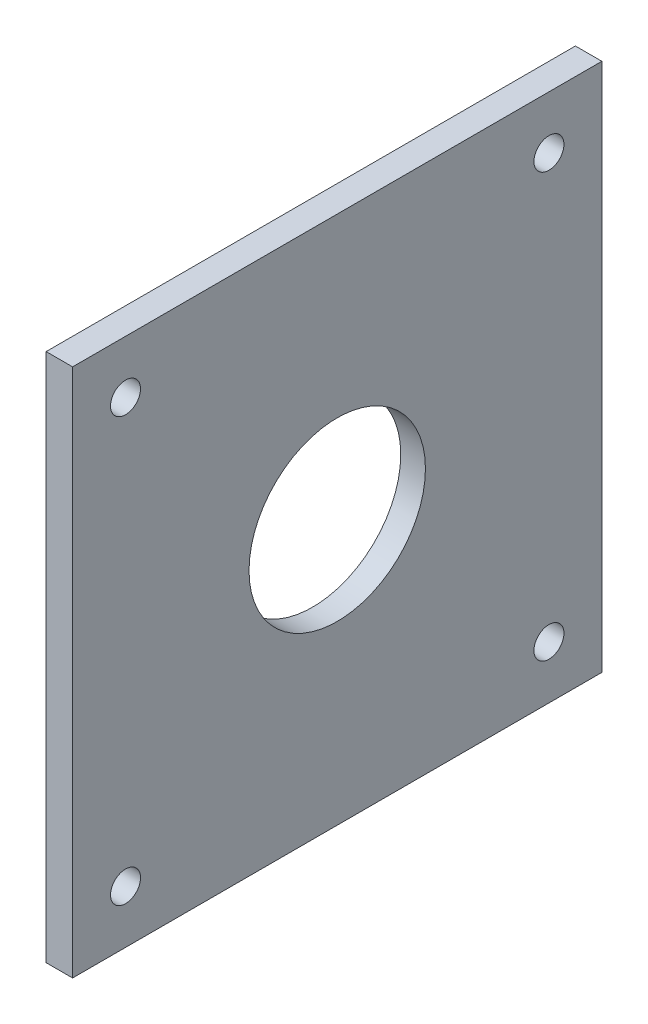
ISO-10303-21;
HEADER;
FILE_DESCRIPTION(('STEP AP214'),'2;1');
FILE_NAME('part.step','',(''),(''),'','','');
FILE_SCHEMA(('AUTOMOTIVE_DESIGN { 1 0 10303 214 1 1 1 1 }'));
ENDSEC;
DATA;
#1=APPLICATION_CONTEXT('core data for automotive mechanical design processes');
#2=APPLICATION_PROTOCOL_DEFINITION('international standard','automotive_design',2000,#1);
#3=PRODUCT_CONTEXT('',#1,'mechanical');
#4=PRODUCT('Part','Part','',(#3));
#5=PRODUCT_RELATED_PRODUCT_CATEGORY('part','',(#4));
#6=PRODUCT_DEFINITION_FORMATION('','',#4);
#7=PRODUCT_DEFINITION_CONTEXT('part definition',#1,'design');
#8=PRODUCT_DEFINITION('design','',#6,#7);
#9=PRODUCT_DEFINITION_SHAPE('','',#8);
#10=(LENGTH_UNIT() NAMED_UNIT(*) SI_UNIT(.MILLI.,.METRE.));
#11=(NAMED_UNIT(*) PLANE_ANGLE_UNIT() SI_UNIT($,.RADIAN.));
#12=(NAMED_UNIT(*) SI_UNIT($,.STERADIAN.) SOLID_ANGLE_UNIT());
#13=UNCERTAINTY_MEASURE_WITH_UNIT(LENGTH_MEASURE(1.E-05),#10,'distance_accuracy_value','');
#14=(GEOMETRIC_REPRESENTATION_CONTEXT(3) GLOBAL_UNCERTAINTY_ASSIGNED_CONTEXT((#13)) GLOBAL_UNIT_ASSIGNED_CONTEXT((#10,
#11,#12)) REPRESENTATION_CONTEXT('',''));
#15=CARTESIAN_POINT('',(0.,0.,0.));
#16=DIRECTION('',(0.,0.,1.));
#17=DIRECTION('',(1.,0.,0.));
#18=AXIS2_PLACEMENT_3D('',#15,#16,#17);
#19=CARTESIAN_POINT('',(0.007799999999975,30.,30.000049774017));
#20=DIRECTION('',(1.,0.,0.));
#21=DIRECTION('',(0.,0.,-1.));
#22=AXIS2_PLACEMENT_3D('',#19,#20,#21);
#23=CYLINDRICAL_SURFACE('',#22,11.1);
#24=CARTESIAN_POINT('',(0.007800000000003,30.,30.000049774017));
#25=DIRECTION('',(1.,0.,0.));
#26=DIRECTION('',(0.,0.,-1.));
#27=AXIS2_PLACEMENT_3D('',#24,#25,#26);
#28=CIRCLE('',#27,11.1);
#29=CARTESIAN_POINT('',(0.007800000000003,30.,18.900049774017));
#30=VERTEX_POINT('',#29);
#31=EDGE_CURVE('E72',#30,#30,#28,.F.);
#32=ORIENTED_EDGE('',*,*,#31,.T.);
#33=EDGE_LOOP('',(#32));
#34=FACE_BOUND('',#33,.T.);
#35=CARTESIAN_POINT('',(0.2078,30.,30.000049774017));
#36=DIRECTION('',(1.,0.,0.));
#37=DIRECTION('',(0.,0.,-1.));
#38=AXIS2_PLACEMENT_3D('',#35,#36,#37);
#39=CIRCLE('',#38,11.1);
#40=CARTESIAN_POINT('',(0.2078,30.,18.900049774017));
#41=VERTEX_POINT('',#40);
#42=EDGE_CURVE('E19',#41,#41,#39,.T.);
#43=ORIENTED_EDGE('',*,*,#42,.T.);
#44=EDGE_LOOP('',(#43));
#45=FACE_BOUND('',#44,.T.);
#46=ADVANCED_FACE('F16',(#34,#45),#23,.F.);
#47=CARTESIAN_POINT('',(0.2078,30.,30.000049774017));
#48=DIRECTION('',(1.,0.,0.));
#49=DIRECTION('',(0.,0.,-1.));
#50=AXIS2_PLACEMENT_3D('',#47,#48,#49);
#51=PLANE('',#50);
#52=CARTESIAN_POINT('',(0.2078,30.,30.000049774017));
#53=DIRECTION('',(1.,0.,0.));
#54=DIRECTION('',(0.,0.,-1.));
#55=AXIS2_PLACEMENT_3D('',#52,#53,#54);
#56=CIRCLE('',#55,10.);
#57=CARTESIAN_POINT('',(0.2078,30.,20.000049774017));
#58=VERTEX_POINT('',#57);
#59=EDGE_CURVE('E102',#58,#58,#56,.T.);
#60=ORIENTED_EDGE('',*,*,#59,.T.);
#61=EDGE_LOOP('',(#60));
#62=FACE_BOUND('',#61,.T.);
#63=ORIENTED_EDGE('',*,*,#42,.F.);
#64=EDGE_LOOP('',(#63));
#65=FACE_BOUND('',#64,.T.);
#66=ADVANCED_FACE('F117',(#62,#65),#51,.F.);
#67=CARTESIAN_POINT('',(0.007799999999975,0.,4.977401658834E-05));
#68=DIRECTION('',(1.,0.,0.));
#69=DIRECTION('',(0.,0.,-1.));
#70=AXIS2_PLACEMENT_3D('',#67,#68,#69);
#71=PLANE('',#70);
#72=CARTESIAN_POINT('',(0.007800000000003,54.,54.000049774017));
#73=DIRECTION('',(1.,0.,0.));
#74=DIRECTION('',(0.,0.,-1.));
#75=AXIS2_PLACEMENT_3D('',#72,#73,#74);
#76=CIRCLE('',#75,1.7);
#77=CARTESIAN_POINT('',(0.007800000000003,54.,52.300049774017));
#78=VERTEX_POINT('',#77);
#79=EDGE_CURVE('E95',#78,#78,#76,.T.);
#80=ORIENTED_EDGE('',*,*,#79,.T.);
#81=EDGE_LOOP('',(#80));
#82=FACE_BOUND('',#81,.T.);
#83=CARTESIAN_POINT('',(0.007800000000003,6.,54.000049774017));
#84=DIRECTION('',(1.,0.,0.));
#85=DIRECTION('',(0.,0.,-1.));
#86=AXIS2_PLACEMENT_3D('',#83,#84,#85);
#87=CIRCLE('',#86,1.7);
#88=CARTESIAN_POINT('',(0.007800000000003,6.,52.300049774017));
#89=VERTEX_POINT('',#88);
#90=EDGE_CURVE('E99',#89,#89,#87,.T.);
#91=ORIENTED_EDGE('',*,*,#90,.T.);
#92=EDGE_LOOP('',(#91));
#93=FACE_BOUND('',#92,.T.);
#94=ORIENTED_EDGE('',*,*,#31,.F.);
#95=EDGE_LOOP('',(#94));
#96=FACE_BOUND('',#95,.T.);
#97=CARTESIAN_POINT('',(0.007800000000003,54.,6.000049774017));
#98=DIRECTION('',(1.,0.,0.));
#99=DIRECTION('',(0.,0.,-1.));
#100=AXIS2_PLACEMENT_3D('',#97,#98,#99);
#101=CIRCLE('',#100,1.7);
#102=CARTESIAN_POINT('',(0.007800000000003,54.,4.300049774017));
#103=VERTEX_POINT('',#102);
#104=EDGE_CURVE('E105',#103,#103,#101,.T.);
#105=ORIENTED_EDGE('',*,*,#104,.T.);
#106=EDGE_LOOP('',(#105));
#107=FACE_BOUND('',#106,.T.);
#108=CARTESIAN_POINT('',(0.007800000000003,6.,6.000049774017));
#109=DIRECTION('',(1.,0.,0.));
#110=DIRECTION('',(0.,0.,-1.));
#111=AXIS2_PLACEMENT_3D('',#108,#109,#110);
#112=CIRCLE('',#111,1.7);
#113=CARTESIAN_POINT('',(0.007800000000003,6.,4.300049774017));
#114=VERTEX_POINT('',#113);
#115=EDGE_CURVE('E108',#114,#114,#112,.T.);
#116=ORIENTED_EDGE('',*,*,#115,.T.);
#117=EDGE_LOOP('',(#116));
#118=FACE_BOUND('',#117,.T.);
#119=DIRECTION('',(0.,0.,1.));
#120=VECTOR('',#119,1.);
#121=CARTESIAN_POINT('',(0.007800000000003,60.,4.977401658834E-05));
#122=LINE('',#121,#120);
#123=CARTESIAN_POINT('',(0.007799999999996,60.,4.977401658834E-05));
#124=VERTEX_POINT('',#123);
#125=CARTESIAN_POINT('',(0.007799999999989,60.,60.000049774017));
#126=VERTEX_POINT('',#125);
#127=EDGE_CURVE('E62',#124,#126,#122,.T.);
#128=ORIENTED_EDGE('',*,*,#127,.F.);
#129=DIRECTION('',(0.,1.,0.));
#130=VECTOR('',#129,1.);
#131=CARTESIAN_POINT('',(0.007800000000003,0.,4.977401658834E-05));
#132=LINE('',#131,#130);
#133=CARTESIAN_POINT('',(0.007799999999989,0.,4.977401658834E-05));
#134=VERTEX_POINT('',#133);
#135=EDGE_CURVE('E55',#124,#134,#132,.F.);
#136=ORIENTED_EDGE('',*,*,#135,.T.);
#137=DIRECTION('',(0.,0.,1.));
#138=VECTOR('',#137,1.);
#139=CARTESIAN_POINT('',(0.007800000000003,0.,4.977401658834E-05));
#140=LINE('',#139,#138);
#141=CARTESIAN_POINT('',(0.007799999999989,0.,60.000049774017));
#142=VERTEX_POINT('',#141);
#143=EDGE_CURVE('E60',#134,#142,#140,.T.);
#144=ORIENTED_EDGE('',*,*,#143,.T.);
#145=DIRECTION('',(0.,1.,0.));
#146=VECTOR('',#145,1.);
#147=CARTESIAN_POINT('',(0.007800000000003,0.,60.000049774017));
#148=LINE('',#147,#146);
#149=EDGE_CURVE('E257',#126,#142,#148,.F.);
#150=ORIENTED_EDGE('',*,*,#149,.F.);
#151=EDGE_LOOP('',(#128,#136,#144,#150));
#152=FACE_BOUND('',#151,.T.);
#153=ADVANCED_FACE('F59',(#82,#93,#96,#107,#118,#152),#71,.F.);
#154=CARTESIAN_POINT('',(0.007799999999975,0.,4.977401658834E-05));
#155=DIRECTION('',(0.,1.,0.));
#156=DIRECTION('',(0.,0.,1.));
#157=AXIS2_PLACEMENT_3D('',#154,#155,#156);
#158=PLANE('',#157);
#159=DIRECTION('',(1.,0.,0.));
#160=VECTOR('',#159,1.);
#161=CARTESIAN_POINT('',(0.007799999999975,0.,60.000049774017));
#162=LINE('',#161,#160);
#163=CARTESIAN_POINT('',(3.0078,0.,60.000049774017));
#164=VERTEX_POINT('',#163);
#165=EDGE_CURVE('E70',#142,#164,#162,.T.);
#166=ORIENTED_EDGE('',*,*,#165,.F.);
#167=ORIENTED_EDGE('',*,*,#143,.F.);
#168=DIRECTION('',(1.,0.,0.));
#169=VECTOR('',#168,1.);
#170=CARTESIAN_POINT('',(0.007799999999975,0.,4.977401658834E-05));
#171=LINE('',#170,#169);
#172=CARTESIAN_POINT('',(3.0078,0.,4.977401658834E-05));
#173=VERTEX_POINT('',#172);
#174=EDGE_CURVE('E64',#134,#173,#171,.T.);
#175=ORIENTED_EDGE('',*,*,#174,.T.);
#176=DIRECTION('',(0.,0.,-1.));
#177=VECTOR('',#176,1.);
#178=CARTESIAN_POINT('',(3.0078,0.,4.977401658834E-05));
#179=LINE('',#178,#177);
#180=EDGE_CURVE('E98',#164,#173,#179,.T.);
#181=ORIENTED_EDGE('',*,*,#180,.F.);
#182=EDGE_LOOP('',(#166,#167,#175,#181));
#183=FACE_BOUND('',#182,.T.);
#184=ADVANCED_FACE('F67',(#183),#158,.F.);
#185=CARTESIAN_POINT('',(0.007799999999975,0.,4.977401658834E-05));
#186=DIRECTION('',(0.,0.,1.));
#187=DIRECTION('',(1.,0.,0.));
#188=AXIS2_PLACEMENT_3D('',#185,#186,#187);
#189=PLANE('',#188);
#190=DIRECTION('',(0.,1.,0.));
#191=VECTOR('',#190,1.);
#192=CARTESIAN_POINT('',(3.0078,0.,4.977401658834E-05));
#193=LINE('',#192,#191);
#194=CARTESIAN_POINT('',(3.0078,60.,4.977401658834E-05));
#195=VERTEX_POINT('',#194);
#196=EDGE_CURVE('E76',#173,#195,#193,.T.);
#197=ORIENTED_EDGE('',*,*,#196,.F.);
#198=ORIENTED_EDGE('',*,*,#174,.F.);
#199=ORIENTED_EDGE('',*,*,#135,.F.);
#200=DIRECTION('',(1.,0.,0.));
#201=VECTOR('',#200,1.);
#202=CARTESIAN_POINT('',(0.007799999999975,60.,4.977401658834E-05));
#203=LINE('',#202,#201);
#204=EDGE_CURVE('E78',#195,#124,#203,.F.);
#205=ORIENTED_EDGE('',*,*,#204,.F.);
#206=EDGE_LOOP('',(#197,#198,#199,#205));
#207=FACE_BOUND('',#206,.T.);
#208=ADVANCED_FACE('F74',(#207),#189,.F.);
#209=CARTESIAN_POINT('',(0.007799999999975,60.,4.977401658834E-05));
#210=DIRECTION('',(0.,1.,0.));
#211=DIRECTION('',(0.,0.,1.));
#212=AXIS2_PLACEMENT_3D('',#209,#210,#211);
#213=PLANE('',#212);
#214=DIRECTION('',(1.,0.,0.));
#215=VECTOR('',#214,1.);
#216=CARTESIAN_POINT('',(0.007799999999975,60.,60.000049774017));
#217=LINE('',#216,#215);
#218=CARTESIAN_POINT('',(3.0078,60.,60.000049774017));
#219=VERTEX_POINT('',#218);
#220=EDGE_CURVE('E34',#219,#126,#217,.F.);
#221=ORIENTED_EDGE('',*,*,#220,.F.);
#222=DIRECTION('',(0.,0.,-1.));
#223=VECTOR('',#222,1.);
#224=CARTESIAN_POINT('',(3.0078,60.,4.977401658834E-05));
#225=LINE('',#224,#223);
#226=EDGE_CURVE('E249',#195,#219,#225,.F.);
#227=ORIENTED_EDGE('',*,*,#226,.F.);
#228=ORIENTED_EDGE('',*,*,#204,.T.);
#229=ORIENTED_EDGE('',*,*,#127,.T.);
#230=EDGE_LOOP('',(#221,#227,#228,#229));
#231=FACE_BOUND('',#230,.T.);
#232=ADVANCED_FACE('F158',(#231),#213,.T.);
#233=CARTESIAN_POINT('',(0.007799999999975,0.,60.000049774017));
#234=DIRECTION('',(0.,0.,1.));
#235=DIRECTION('',(1.,0.,0.));
#236=AXIS2_PLACEMENT_3D('',#233,#234,#235);
#237=PLANE('',#236);
#238=DIRECTION('',(0.,1.,0.));
#239=VECTOR('',#238,1.);
#240=CARTESIAN_POINT('',(3.0078,0.,60.000049774017));
#241=LINE('',#240,#239);
#242=EDGE_CURVE('E94',#219,#164,#241,.F.);
#243=ORIENTED_EDGE('',*,*,#242,.F.);
#244=ORIENTED_EDGE('',*,*,#220,.T.);
#245=ORIENTED_EDGE('',*,*,#149,.T.);
#246=ORIENTED_EDGE('',*,*,#165,.T.);
#247=EDGE_LOOP('',(#243,#244,#245,#246));
#248=FACE_BOUND('',#247,.T.);
#249=ADVANCED_FACE('F154',(#248),#237,.T.);
#250=CARTESIAN_POINT('',(0.007799999999975,6.,6.000049774017));
#251=DIRECTION('',(1.,0.,0.));
#252=DIRECTION('',(0.,0.,-1.));
#253=AXIS2_PLACEMENT_3D('',#250,#251,#252);
#254=CYLINDRICAL_SURFACE('',#253,1.7);
#255=ORIENTED_EDGE('',*,*,#115,.F.);
#256=EDGE_LOOP('',(#255));
#257=FACE_BOUND('',#256,.T.);
#258=CARTESIAN_POINT('',(3.0078,6.,6.000049774017));
#259=DIRECTION('',(1.,0.,0.));
#260=DIRECTION('',(0.,0.,-1.));
#261=AXIS2_PLACEMENT_3D('',#258,#259,#260);
#262=CIRCLE('',#261,1.7);
#263=CARTESIAN_POINT('',(3.0078,6.,4.300049774017));
#264=VERTEX_POINT('',#263);
#265=EDGE_CURVE('E91',#264,#264,#262,.F.);
#266=ORIENTED_EDGE('',*,*,#265,.F.);
#267=EDGE_LOOP('',(#266));
#268=FACE_BOUND('',#267,.T.);
#269=ADVANCED_FACE('F150',(#257,#268),#254,.F.);
#270=CARTESIAN_POINT('',(0.007799999999975,54.,6.000049774017));
#271=DIRECTION('',(1.,0.,0.));
#272=DIRECTION('',(0.,0.,-1.));
#273=AXIS2_PLACEMENT_3D('',#270,#271,#272);
#274=CYLINDRICAL_SURFACE('',#273,1.7);
#275=ORIENTED_EDGE('',*,*,#104,.F.);
#276=EDGE_LOOP('',(#275));
#277=FACE_BOUND('',#276,.T.);
#278=CARTESIAN_POINT('',(3.0078,54.,6.000049774017));
#279=DIRECTION('',(1.,0.,0.));
#280=DIRECTION('',(0.,0.,-1.));
#281=AXIS2_PLACEMENT_3D('',#278,#279,#280);
#282=CIRCLE('',#281,1.7);
#283=CARTESIAN_POINT('',(3.0078,54.,4.300049774017));
#284=VERTEX_POINT('',#283);
#285=EDGE_CURVE('E88',#284,#284,#282,.F.);
#286=ORIENTED_EDGE('',*,*,#285,.F.);
#287=EDGE_LOOP('',(#286));
#288=FACE_BOUND('',#287,.T.);
#289=ADVANCED_FACE('F146',(#277,#288),#274,.F.);
#290=CARTESIAN_POINT('',(0.007799999999975,30.,30.000049774017));
#291=DIRECTION('',(1.,0.,0.));
#292=DIRECTION('',(0.,0.,-1.));
#293=AXIS2_PLACEMENT_3D('',#290,#291,#292);
#294=CYLINDRICAL_SURFACE('',#293,10.);
#295=CARTESIAN_POINT('',(3.0078,30.,30.000049774017));
#296=DIRECTION('',(1.,0.,0.));
#297=DIRECTION('',(0.,0.,-1.));
#298=AXIS2_PLACEMENT_3D('',#295,#296,#297);
#299=CIRCLE('',#298,10.);
#300=CARTESIAN_POINT('',(3.0078,30.,20.000049774017));
#301=VERTEX_POINT('',#300);
#302=EDGE_CURVE('E85',#301,#301,#299,.F.);
#303=ORIENTED_EDGE('',*,*,#302,.F.);
#304=EDGE_LOOP('',(#303));
#305=FACE_BOUND('',#304,.T.);
#306=ORIENTED_EDGE('',*,*,#59,.F.);
#307=EDGE_LOOP('',(#306));
#308=FACE_BOUND('',#307,.T.);
#309=ADVANCED_FACE('F142',(#305,#308),#294,.F.);
#310=CARTESIAN_POINT('',(0.007799999999975,6.,54.000049774017));
#311=DIRECTION('',(1.,0.,0.));
#312=DIRECTION('',(0.,0.,-1.));
#313=AXIS2_PLACEMENT_3D('',#310,#311,#312);
#314=CYLINDRICAL_SURFACE('',#313,1.7);
#315=ORIENTED_EDGE('',*,*,#90,.F.);
#316=EDGE_LOOP('',(#315));
#317=FACE_BOUND('',#316,.T.);
#318=CARTESIAN_POINT('',(3.0078,6.,54.000049774017));
#319=DIRECTION('',(1.,0.,0.));
#320=DIRECTION('',(0.,0.,-1.));
#321=AXIS2_PLACEMENT_3D('',#318,#319,#320);
#322=CIRCLE('',#321,1.7);
#323=CARTESIAN_POINT('',(3.0078,6.,52.300049774017));
#324=VERTEX_POINT('',#323);
#325=EDGE_CURVE('E25',#324,#324,#322,.F.);
#326=ORIENTED_EDGE('',*,*,#325,.F.);
#327=EDGE_LOOP('',(#326));
#328=FACE_BOUND('',#327,.T.);
#329=ADVANCED_FACE('F135',(#317,#328),#314,.F.);
#330=CARTESIAN_POINT('',(0.007799999999975,54.,54.000049774017));
#331=DIRECTION('',(1.,0.,0.));
#332=DIRECTION('',(0.,0.,-1.));
#333=AXIS2_PLACEMENT_3D('',#330,#331,#332);
#334=CYLINDRICAL_SURFACE('',#333,1.7);
#335=ORIENTED_EDGE('',*,*,#79,.F.);
#336=EDGE_LOOP('',(#335));
#337=FACE_BOUND('',#336,.T.);
#338=CARTESIAN_POINT('',(3.0078,54.,54.000049774017));
#339=DIRECTION('',(1.,0.,0.));
#340=DIRECTION('',(0.,0.,-1.));
#341=AXIS2_PLACEMENT_3D('',#338,#339,#340);
#342=CIRCLE('',#341,1.7);
#343=CARTESIAN_POINT('',(3.0078,54.,52.300049774017));
#344=VERTEX_POINT('',#343);
#345=EDGE_CURVE('E11',#344,#344,#342,.F.);
#346=ORIENTED_EDGE('',*,*,#345,.F.);
#347=EDGE_LOOP('',(#346));
#348=FACE_BOUND('',#347,.T.);
#349=ADVANCED_FACE('F129',(#337,#348),#334,.F.);
#350=CARTESIAN_POINT('',(3.0078,0.,4.977401658834E-05));
#351=DIRECTION('',(1.,0.,0.));
#352=DIRECTION('',(0.,0.,-1.));
#353=AXIS2_PLACEMENT_3D('',#350,#351,#352);
#354=PLANE('',#353);
#355=ORIENTED_EDGE('',*,*,#345,.T.);
#356=EDGE_LOOP('',(#355));
#357=FACE_BOUND('',#356,.T.);
#358=ORIENTED_EDGE('',*,*,#325,.T.);
#359=EDGE_LOOP('',(#358));
#360=FACE_BOUND('',#359,.T.);
#361=ORIENTED_EDGE('',*,*,#302,.T.);
#362=EDGE_LOOP('',(#361));
#363=FACE_BOUND('',#362,.T.);
#364=ORIENTED_EDGE('',*,*,#285,.T.);
#365=EDGE_LOOP('',(#364));
#366=FACE_BOUND('',#365,.T.);
#367=ORIENTED_EDGE('',*,*,#265,.T.);
#368=EDGE_LOOP('',(#367));
#369=FACE_BOUND('',#368,.T.);
#370=ORIENTED_EDGE('',*,*,#226,.T.);
#371=ORIENTED_EDGE('',*,*,#242,.T.);
#372=ORIENTED_EDGE('',*,*,#180,.T.);
#373=ORIENTED_EDGE('',*,*,#196,.T.);
#374=EDGE_LOOP('',(#370,#371,#372,#373));
#375=FACE_BOUND('',#374,.T.);
#376=ADVANCED_FACE('F127',(#357,#360,#363,#366,#369,#375),#354,.T.);
#377=CLOSED_SHELL('',(#46,#66,#153,#184,#208,#232,#249,#269,#289,#309,#329,#349,#376));
#378=MANIFOLD_SOLID_BREP('B1',#377);
#379=ADVANCED_BREP_SHAPE_REPRESENTATION('',(#18,#378),#14);
#380=SHAPE_DEFINITION_REPRESENTATION(#9,#379);
ENDSEC;
END-ISO-10303-21;
